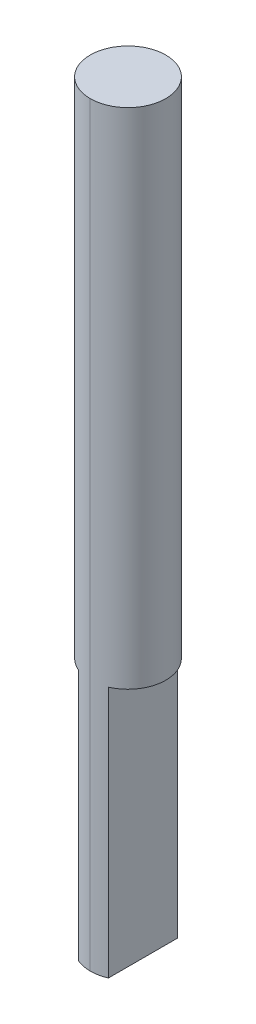
ISO-10303-21;
HEADER;
FILE_DESCRIPTION(('STEP AP214'),'2;1');
FILE_NAME('part.step','',(''),(''),'','','');
FILE_SCHEMA(('AUTOMOTIVE_DESIGN { 1 0 10303 214 1 1 1 1 }'));
ENDSEC;
DATA;
#1=APPLICATION_CONTEXT('core data for automotive mechanical design processes');
#2=APPLICATION_PROTOCOL_DEFINITION('international standard','automotive_design',2000,#1);
#3=PRODUCT_CONTEXT('',#1,'mechanical');
#4=PRODUCT('Part','Part','',(#3));
#5=PRODUCT_RELATED_PRODUCT_CATEGORY('part','',(#4));
#6=PRODUCT_DEFINITION_FORMATION('','',#4);
#7=PRODUCT_DEFINITION_CONTEXT('part definition',#1,'design');
#8=PRODUCT_DEFINITION('design','',#6,#7);
#9=PRODUCT_DEFINITION_SHAPE('','',#8);
#10=(LENGTH_UNIT() NAMED_UNIT(*) SI_UNIT(.MILLI.,.METRE.));
#11=(NAMED_UNIT(*) PLANE_ANGLE_UNIT() SI_UNIT($,.RADIAN.));
#12=(NAMED_UNIT(*) SI_UNIT($,.STERADIAN.) SOLID_ANGLE_UNIT());
#13=UNCERTAINTY_MEASURE_WITH_UNIT(LENGTH_MEASURE(1.E-05),#10,'distance_accuracy_value','');
#14=(GEOMETRIC_REPRESENTATION_CONTEXT(3) GLOBAL_UNCERTAINTY_ASSIGNED_CONTEXT((#13)) GLOBAL_UNIT_ASSIGNED_CONTEXT((#10,
#11,#12)) REPRESENTATION_CONTEXT('',''));
#15=CARTESIAN_POINT('',(0.,0.,0.));
#16=DIRECTION('',(0.,0.,1.));
#17=DIRECTION('',(1.,0.,0.));
#18=AXIS2_PLACEMENT_3D('',#15,#16,#17);
#19=CARTESIAN_POINT('',(0.,5.,0.));
#20=DIRECTION('',(0.,-1.,0.));
#21=DIRECTION('',(0.,0.,-1.));
#22=AXIS2_PLACEMENT_3D('',#19,#20,#21);
#23=PLANE('',#22);
#24=CARTESIAN_POINT('',(0.,5.,0.));
#25=DIRECTION('',(0.,-1.,0.));
#26=DIRECTION('',(0.,0.,-1.));
#27=AXIS2_PLACEMENT_3D('',#24,#25,#26);
#28=CIRCLE('',#27,0.75);
#29=CARTESIAN_POINT('',(-0.3,5.,0.687386354243376));
#30=VERTEX_POINT('',#29);
#31=CARTESIAN_POINT('',(-0.3,5.,-0.687386354243376));
#32=VERTEX_POINT('',#31);
#33=EDGE_CURVE('E135',#30,#32,#28,.T.);
#34=ORIENTED_EDGE('',*,*,#33,.T.);
#35=DIRECTION('',(0.,0.,1.));
#36=VECTOR('',#35,1.);
#37=CARTESIAN_POINT('',(-0.3,5.,0.687386354243376));
#38=LINE('',#37,#36);
#39=EDGE_CURVE('E11',#32,#30,#38,.T.);
#40=ORIENTED_EDGE('',*,*,#39,.T.);
#41=EDGE_LOOP('',(#34,#40));
#42=FACE_BOUND('',#41,.T.);
#43=ADVANCED_FACE('F17',(#42),#23,.T.);
#44=CARTESIAN_POINT('',(-0.3,5.,0.687386354243376));
#45=DIRECTION('',(1.,0.,0.));
#46=DIRECTION('',(0.,1.,0.));
#47=AXIS2_PLACEMENT_3D('',#44,#45,#46);
#48=PLANE('',#47);
#49=DIRECTION('',(0.,0.,1.));
#50=VECTOR('',#49,1.);
#51=CARTESIAN_POINT('',(-0.3,0.,0.687386354243376));
#52=LINE('',#51,#50);
#53=CARTESIAN_POINT('',(-0.3,0.,-0.687386354243376));
#54=VERTEX_POINT('',#53);
#55=CARTESIAN_POINT('',(-0.3,0.,0.687386354243376));
#56=VERTEX_POINT('',#55);
#57=EDGE_CURVE('E39',#54,#56,#52,.T.);
#58=ORIENTED_EDGE('',*,*,#57,.T.);
#59=DIRECTION('',(0.,-1.,0.));
#60=VECTOR('',#59,1.);
#61=CARTESIAN_POINT('',(-0.3,5.,0.687386354243376));
#62=LINE('',#61,#60);
#63=EDGE_CURVE('E131',#30,#56,#62,.T.);
#64=ORIENTED_EDGE('',*,*,#63,.F.);
#65=ORIENTED_EDGE('',*,*,#39,.F.);
#66=DIRECTION('',(0.,-1.,0.));
#67=VECTOR('',#66,1.);
#68=CARTESIAN_POINT('',(-0.3,5.,-0.687386354243376));
#69=LINE('',#68,#67);
#70=EDGE_CURVE('E139',#32,#54,#69,.T.);
#71=ORIENTED_EDGE('',*,*,#70,.T.);
#72=EDGE_LOOP('',(#58,#64,#65,#71));
#73=FACE_BOUND('',#72,.T.);
#74=ADVANCED_FACE('F173',(#73),#48,.F.);
#75=CARTESIAN_POINT('',(0.,5.,0.));
#76=DIRECTION('',(0.,-1.,0.));
#77=DIRECTION('',(0.,0.,-1.));
#78=AXIS2_PLACEMENT_3D('',#75,#76,#77);
#79=PLANE('',#78);
#80=CARTESIAN_POINT('',(0.,5.,0.));
#81=DIRECTION('',(0.,-1.,0.));
#82=DIRECTION('',(0.,0.,-1.));
#83=AXIS2_PLACEMENT_3D('',#80,#81,#82);
#84=CIRCLE('',#83,0.75);
#85=CARTESIAN_POINT('',(0.3,5.,-0.687386354243376));
#86=VERTEX_POINT('',#85);
#87=CARTESIAN_POINT('',(0.3,5.,0.687386354243376));
#88=VERTEX_POINT('',#87);
#89=EDGE_CURVE('E142',#86,#88,#84,.T.);
#90=ORIENTED_EDGE('',*,*,#89,.T.);
#91=DIRECTION('',(0.,0.,-1.));
#92=VECTOR('',#91,1.);
#93=CARTESIAN_POINT('',(0.3,5.,0.687386354243376));
#94=LINE('',#93,#92);
#95=EDGE_CURVE('E26',#88,#86,#94,.T.);
#96=ORIENTED_EDGE('',*,*,#95,.T.);
#97=EDGE_LOOP('',(#90,#96));
#98=FACE_BOUND('',#97,.T.);
#99=ADVANCED_FACE('F164',(#98),#79,.T.);
#100=CARTESIAN_POINT('',(0.3,5.,0.687386354243376));
#101=DIRECTION('',(-1.,0.,0.));
#102=DIRECTION('',(0.,0.,1.));
#103=AXIS2_PLACEMENT_3D('',#100,#101,#102);
#104=PLANE('',#103);
#105=DIRECTION('',(0.,0.,-1.));
#106=VECTOR('',#105,1.);
#107=CARTESIAN_POINT('',(0.3,0.,0.687386354243376));
#108=LINE('',#107,#106);
#109=CARTESIAN_POINT('',(0.3,0.,0.687386354243376));
#110=VERTEX_POINT('',#109);
#111=CARTESIAN_POINT('',(0.3,0.,-0.687386354243376));
#112=VERTEX_POINT('',#111);
#113=EDGE_CURVE('E71',#110,#112,#108,.T.);
#114=ORIENTED_EDGE('',*,*,#113,.T.);
#115=DIRECTION('',(0.,-1.,0.));
#116=VECTOR('',#115,1.);
#117=CARTESIAN_POINT('',(0.3,5.,-0.687386354243376));
#118=LINE('',#117,#116);
#119=EDGE_CURVE('E127',#86,#112,#118,.T.);
#120=ORIENTED_EDGE('',*,*,#119,.F.);
#121=ORIENTED_EDGE('',*,*,#95,.F.);
#122=DIRECTION('',(0.,-1.,0.));
#123=VECTOR('',#122,1.);
#124=CARTESIAN_POINT('',(0.3,5.,0.687386354243376));
#125=LINE('',#124,#123);
#126=EDGE_CURVE('E134',#88,#110,#125,.T.);
#127=ORIENTED_EDGE('',*,*,#126,.T.);
#128=EDGE_LOOP('',(#114,#120,#121,#127));
#129=FACE_BOUND('',#128,.T.);
#130=ADVANCED_FACE('F168',(#129),#104,.F.);
#131=CARTESIAN_POINT('',(0.,0.,0.));
#132=DIRECTION('',(0.,1.,0.));
#133=DIRECTION('',(1.,0.,0.));
#134=AXIS2_PLACEMENT_3D('',#131,#132,#133);
#135=PLANE('',#134);
#136=CARTESIAN_POINT('',(0.,0.,0.));
#137=DIRECTION('',(0.,1.,0.));
#138=DIRECTION('',(0.,0.,1.));
#139=AXIS2_PLACEMENT_3D('',#136,#137,#138);
#140=CIRCLE('',#139,0.75);
#141=CARTESIAN_POINT('',(0.,0.,0.75));
#142=VERTEX_POINT('',#141);
#143=EDGE_CURVE('E112',#56,#142,#140,.T.);
#144=ORIENTED_EDGE('',*,*,#143,.F.);
#145=ORIENTED_EDGE('',*,*,#57,.F.);
#146=CARTESIAN_POINT('',(0.,0.,0.));
#147=DIRECTION('',(0.,1.,0.));
#148=DIRECTION('',(0.,0.,1.));
#149=AXIS2_PLACEMENT_3D('',#146,#147,#148);
#150=CIRCLE('',#149,0.75);
#151=CARTESIAN_POINT('',(0.,0.,-0.75));
#152=VERTEX_POINT('',#151);
#153=EDGE_CURVE('E60',#152,#54,#150,.T.);
#154=ORIENTED_EDGE('',*,*,#153,.F.);
#155=CARTESIAN_POINT('',(0.,0.,0.));
#156=DIRECTION('',(0.,1.,0.));
#157=DIRECTION('',(0.,0.,1.));
#158=AXIS2_PLACEMENT_3D('',#155,#156,#157);
#159=CIRCLE('',#158,0.75);
#160=EDGE_CURVE('E148',#112,#152,#159,.T.);
#161=ORIENTED_EDGE('',*,*,#160,.F.);
#162=ORIENTED_EDGE('',*,*,#113,.F.);
#163=CARTESIAN_POINT('',(0.,0.,0.));
#164=DIRECTION('',(0.,1.,0.));
#165=DIRECTION('',(0.,0.,1.));
#166=AXIS2_PLACEMENT_3D('',#163,#164,#165);
#167=CIRCLE('',#166,0.75);
#168=EDGE_CURVE('E117',#142,#110,#167,.T.);
#169=ORIENTED_EDGE('',*,*,#168,.F.);
#170=EDGE_LOOP('',(#144,#145,#154,#161,#162,#169));
#171=FACE_BOUND('',#170,.T.);
#172=ADVANCED_FACE('F170',(#171),#135,.F.);
#173=CARTESIAN_POINT('',(0.,15.,0.));
#174=DIRECTION('',(0.,1.,0.));
#175=DIRECTION('',(1.,0.,0.));
#176=AXIS2_PLACEMENT_3D('',#173,#174,#175);
#177=PLANE('',#176);
#178=CARTESIAN_POINT('',(0.,15.,0.));
#179=DIRECTION('',(0.,1.,0.));
#180=DIRECTION('',(0.,0.,1.));
#181=AXIS2_PLACEMENT_3D('',#178,#179,#180);
#182=CIRCLE('',#181,0.75);
#183=CARTESIAN_POINT('',(0.,15.,-0.75));
#184=VERTEX_POINT('',#183);
#185=CARTESIAN_POINT('',(0.,15.,0.75));
#186=VERTEX_POINT('',#185);
#187=EDGE_CURVE('E98',#184,#186,#182,.T.);
#188=ORIENTED_EDGE('',*,*,#187,.T.);
#189=CARTESIAN_POINT('',(0.,15.,0.));
#190=DIRECTION('',(0.,1.,0.));
#191=DIRECTION('',(0.,0.,1.));
#192=AXIS2_PLACEMENT_3D('',#189,#190,#191);
#193=CIRCLE('',#192,0.75);
#194=EDGE_CURVE('E102',#186,#184,#193,.T.);
#195=ORIENTED_EDGE('',*,*,#194,.T.);
#196=EDGE_LOOP('',(#188,#195));
#197=FACE_BOUND('',#196,.T.);
#198=ADVANCED_FACE('F100',(#197),#177,.T.);
#199=CARTESIAN_POINT('',(0.,15.,0.));
#200=DIRECTION('',(0.,-1.,0.));
#201=DIRECTION('',(0.,0.,-1.));
#202=AXIS2_PLACEMENT_3D('',#199,#200,#201);
#203=CYLINDRICAL_SURFACE('',#202,0.75);
#204=DIRECTION('',(0.,-1.,0.));
#205=VECTOR('',#204,1.);
#206=CARTESIAN_POINT('',(0.,15.,0.75));
#207=LINE('',#206,#205);
#208=EDGE_CURVE('E109',#186,#142,#207,.T.);
#209=ORIENTED_EDGE('',*,*,#208,.F.);
#210=ORIENTED_EDGE('',*,*,#187,.F.);
#211=DIRECTION('',(0.,-1.,0.));
#212=VECTOR('',#211,1.);
#213=CARTESIAN_POINT('',(0.,15.,-0.75));
#214=LINE('',#213,#212);
#215=EDGE_CURVE('E106',#184,#152,#214,.T.);
#216=ORIENTED_EDGE('',*,*,#215,.T.);
#217=ORIENTED_EDGE('',*,*,#153,.T.);
#218=ORIENTED_EDGE('',*,*,#70,.F.);
#219=ORIENTED_EDGE('',*,*,#33,.F.);
#220=ORIENTED_EDGE('',*,*,#63,.T.);
#221=ORIENTED_EDGE('',*,*,#143,.T.);
#222=EDGE_LOOP('',(#209,#210,#216,#217,#218,#219,#220,#221));
#223=FACE_BOUND('',#222,.T.);
#224=ADVANCED_FACE('F110',(#223),#203,.T.);
#225=CARTESIAN_POINT('',(0.,15.,0.));
#226=DIRECTION('',(0.,-1.,0.));
#227=DIRECTION('',(0.,0.,-1.));
#228=AXIS2_PLACEMENT_3D('',#225,#226,#227);
#229=CYLINDRICAL_SURFACE('',#228,0.75);
#230=ORIENTED_EDGE('',*,*,#194,.F.);
#231=ORIENTED_EDGE('',*,*,#208,.T.);
#232=ORIENTED_EDGE('',*,*,#168,.T.);
#233=ORIENTED_EDGE('',*,*,#126,.F.);
#234=ORIENTED_EDGE('',*,*,#89,.F.);
#235=ORIENTED_EDGE('',*,*,#119,.T.);
#236=ORIENTED_EDGE('',*,*,#160,.T.);
#237=ORIENTED_EDGE('',*,*,#215,.F.);
#238=EDGE_LOOP('',(#230,#231,#232,#233,#234,#235,#236,#237));
#239=FACE_BOUND('',#238,.T.);
#240=ADVANCED_FACE('F119',(#239),#229,.T.);
#241=CLOSED_SHELL('',(#43,#74,#99,#130,#172,#198,#224,#240));
#242=MANIFOLD_SOLID_BREP('B1',#241);
#243=ADVANCED_BREP_SHAPE_REPRESENTATION('',(#18,#242),#14);
#244=SHAPE_DEFINITION_REPRESENTATION(#9,#243);
ENDSEC;
END-ISO-10303-21;
